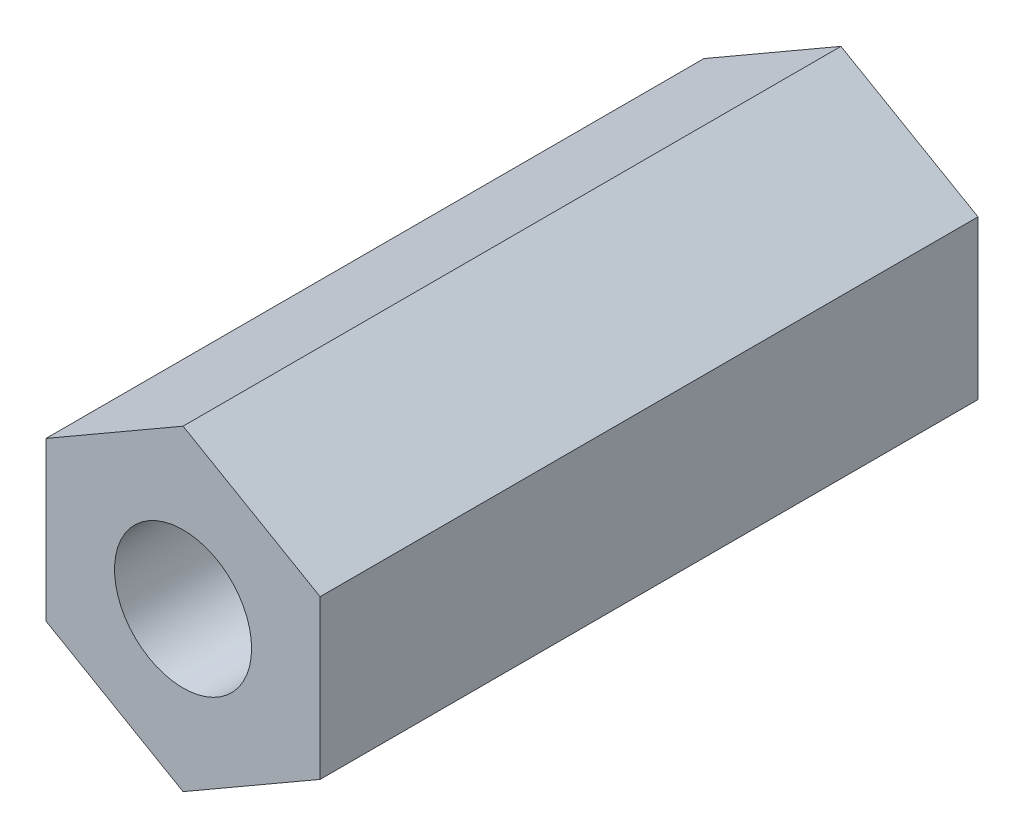
ISO-10303-21;
HEADER;
FILE_DESCRIPTION(('STEP AP214'),'2;1');
FILE_NAME('part.step','',(''),(''),'','','');
FILE_SCHEMA(('AUTOMOTIVE_DESIGN { 1 0 10303 214 1 1 1 1 }'));
ENDSEC;
DATA;
#1=APPLICATION_CONTEXT('core data for automotive mechanical design processes');
#2=APPLICATION_PROTOCOL_DEFINITION('international standard','automotive_design',2000,#1);
#3=PRODUCT_CONTEXT('',#1,'mechanical');
#4=PRODUCT('Part','Part','',(#3));
#5=PRODUCT_RELATED_PRODUCT_CATEGORY('part','',(#4));
#6=PRODUCT_DEFINITION_FORMATION('','',#4);
#7=PRODUCT_DEFINITION_CONTEXT('part definition',#1,'design');
#8=PRODUCT_DEFINITION('design','',#6,#7);
#9=PRODUCT_DEFINITION_SHAPE('','',#8);
#10=(LENGTH_UNIT() NAMED_UNIT(*) SI_UNIT(.MILLI.,.METRE.));
#11=(NAMED_UNIT(*) PLANE_ANGLE_UNIT() SI_UNIT($,.RADIAN.));
#12=(NAMED_UNIT(*) SI_UNIT($,.STERADIAN.) SOLID_ANGLE_UNIT());
#13=UNCERTAINTY_MEASURE_WITH_UNIT(LENGTH_MEASURE(1.E-05),#10,'distance_accuracy_value','');
#14=(GEOMETRIC_REPRESENTATION_CONTEXT(3) GLOBAL_UNCERTAINTY_ASSIGNED_CONTEXT((#13)) GLOBAL_UNIT_ASSIGNED_CONTEXT((#10,
#11,#12)) REPRESENTATION_CONTEXT('',''));
#15=CARTESIAN_POINT('',(0.,0.,0.));
#16=DIRECTION('',(0.,0.,1.));
#17=DIRECTION('',(1.,0.,0.));
#18=AXIS2_PLACEMENT_3D('',#15,#16,#17);
#19=CARTESIAN_POINT('',(2.5,-1.45337567297407,-0.01));
#20=DIRECTION('',(1.,0.,0.));
#21=DIRECTION('',(0.,1.,0.));
#22=AXIS2_PLACEMENT_3D('',#19,#20,#21);
#23=PLANE('',#22);
#24=DIRECTION('',(0.,1.,0.));
#25=VECTOR('',#24,1.);
#26=CARTESIAN_POINT('',(2.5,0.,12.));
#27=LINE('',#26,#25);
#28=CARTESIAN_POINT('',(2.5,-1.44337567297407,12.));
#29=VERTEX_POINT('',#28);
#30=CARTESIAN_POINT('',(2.5,1.44337567297406,12.));
#31=VERTEX_POINT('',#30);
#32=EDGE_CURVE('E89',#29,#31,#27,.T.);
#33=ORIENTED_EDGE('',*,*,#32,.F.);
#34=DIRECTION('',(0.,0.,1.));
#35=VECTOR('',#34,1.);
#36=CARTESIAN_POINT('',(2.5,-1.44337567297407,6.));
#37=LINE('',#36,#35);
#38=CARTESIAN_POINT('',(2.5,-1.44337567297407,0.));
#39=VERTEX_POINT('',#38);
#40=EDGE_CURVE('E96',#39,#29,#37,.T.);
#41=ORIENTED_EDGE('',*,*,#40,.F.);
#42=DIRECTION('',(0.,-1.,0.));
#43=VECTOR('',#42,1.);
#44=CARTESIAN_POINT('',(2.5,0.,0.));
#45=LINE('',#44,#43);
#46=CARTESIAN_POINT('',(2.5,1.44337567297406,0.));
#47=VERTEX_POINT('',#46);
#48=EDGE_CURVE('E106',#47,#39,#45,.T.);
#49=ORIENTED_EDGE('',*,*,#48,.F.);
#50=DIRECTION('',(0.,0.,-1.));
#51=VECTOR('',#50,1.);
#52=CARTESIAN_POINT('',(2.5,1.44337567297406,6.));
#53=LINE('',#52,#51);
#54=EDGE_CURVE('E68',#31,#47,#53,.T.);
#55=ORIENTED_EDGE('',*,*,#54,.F.);
#56=EDGE_LOOP('',(#33,#41,#49,#55));
#57=FACE_BOUND('',#56,.T.);
#58=ADVANCED_FACE('F17',(#57),#23,.T.);
#59=CARTESIAN_POINT('',(-0.00866025403784533,-2.89175134594813,-0.01));
#60=DIRECTION('',(0.499999999999998,-0.86602540378444,0.));
#61=DIRECTION('',(0.86602540378444,0.499999999999998,0.));
#62=AXIS2_PLACEMENT_3D('',#59,#60,#61);
#63=PLANE('',#62);
#64=DIRECTION('',(0.866025403784439,0.499999999999999,0.));
#65=VECTOR('',#64,1.);
#66=CARTESIAN_POINT('',(0.,-2.88675134594813,12.));
#67=LINE('',#66,#65);
#68=CARTESIAN_POINT('',(0.,-2.88675134594813,12.));
#69=VERTEX_POINT('',#68);
#70=EDGE_CURVE('E109',#69,#29,#67,.T.);
#71=ORIENTED_EDGE('',*,*,#70,.F.);
#72=DIRECTION('',(0.,0.,1.));
#73=VECTOR('',#72,1.);
#74=CARTESIAN_POINT('',(0.,-2.88675134594813,6.));
#75=LINE('',#74,#73);
#76=CARTESIAN_POINT('',(0.,-2.88675134594813,0.));
#77=VERTEX_POINT('',#76);
#78=EDGE_CURVE('E94',#77,#69,#75,.T.);
#79=ORIENTED_EDGE('',*,*,#78,.F.);
#80=DIRECTION('',(-0.866025403784439,-0.499999999999999,0.));
#81=VECTOR('',#80,1.);
#82=CARTESIAN_POINT('',(2.5,-1.44337567297407,0.));
#83=LINE('',#82,#81);
#84=EDGE_CURVE('E108',#39,#77,#83,.T.);
#85=ORIENTED_EDGE('',*,*,#84,.F.);
#86=ORIENTED_EDGE('',*,*,#40,.T.);
#87=EDGE_LOOP('',(#71,#79,#85,#86));
#88=FACE_BOUND('',#87,.T.);
#89=ADVANCED_FACE('F131',(#88),#63,.T.);
#90=CARTESIAN_POINT('',(-2.50866025403784,-1.43837567297407,-0.01));
#91=DIRECTION('',(-0.5,-0.866025403784439,0.));
#92=DIRECTION('',(0.866025403784439,-0.5,0.));
#93=AXIS2_PLACEMENT_3D('',#90,#91,#92);
#94=PLANE('',#93);
#95=DIRECTION('',(0.866025403784438,-0.500000000000001,0.));
#96=VECTOR('',#95,1.);
#97=CARTESIAN_POINT('',(-2.49999999999999,-1.44337567297407,12.));
#98=LINE('',#97,#96);
#99=CARTESIAN_POINT('',(-2.49999999999999,-1.44337567297407,12.));
#100=VERTEX_POINT('',#99);
#101=EDGE_CURVE('E120',#100,#69,#98,.T.);
#102=ORIENTED_EDGE('',*,*,#101,.F.);
#103=DIRECTION('',(0.,0.,1.));
#104=VECTOR('',#103,1.);
#105=CARTESIAN_POINT('',(-2.49999999999999,-1.44337567297407,6.));
#106=LINE('',#105,#104);
#107=CARTESIAN_POINT('',(-2.49999999999999,-1.44337567297407,0.));
#108=VERTEX_POINT('',#107);
#109=EDGE_CURVE('E100',#108,#100,#106,.T.);
#110=ORIENTED_EDGE('',*,*,#109,.F.);
#111=DIRECTION('',(-0.866025403784438,0.500000000000001,0.));
#112=VECTOR('',#111,1.);
#113=CARTESIAN_POINT('',(0.,-2.88675134594813,0.));
#114=LINE('',#113,#112);
#115=EDGE_CURVE('E105',#77,#108,#114,.T.);
#116=ORIENTED_EDGE('',*,*,#115,.F.);
#117=ORIENTED_EDGE('',*,*,#78,.T.);
#118=EDGE_LOOP('',(#102,#110,#116,#117));
#119=FACE_BOUND('',#118,.T.);
#120=ADVANCED_FACE('F128',(#119),#94,.T.);
#121=CARTESIAN_POINT('',(-2.49999999999999,1.45337567297406,-0.01));
#122=DIRECTION('',(-1.,0.,0.));
#123=DIRECTION('',(0.,-1.,0.));
#124=AXIS2_PLACEMENT_3D('',#121,#122,#123);
#125=PLANE('',#124);
#126=DIRECTION('',(0.,-1.,0.));
#127=VECTOR('',#126,1.);
#128=CARTESIAN_POINT('',(-2.49999999999999,0.,12.));
#129=LINE('',#128,#127);
#130=CARTESIAN_POINT('',(-2.49999999999999,1.44337567297406,12.));
#131=VERTEX_POINT('',#130);
#132=EDGE_CURVE('E85',#131,#100,#129,.T.);
#133=ORIENTED_EDGE('',*,*,#132,.F.);
#134=DIRECTION('',(0.,0.,1.));
#135=VECTOR('',#134,1.);
#136=CARTESIAN_POINT('',(-2.49999999999999,1.44337567297406,6.));
#137=LINE('',#136,#135);
#138=CARTESIAN_POINT('',(-2.49999999999999,1.44337567297406,0.));
#139=VERTEX_POINT('',#138);
#140=EDGE_CURVE('E77',#139,#131,#137,.T.);
#141=ORIENTED_EDGE('',*,*,#140,.F.);
#142=DIRECTION('',(0.,1.,0.));
#143=VECTOR('',#142,1.);
#144=CARTESIAN_POINT('',(-2.49999999999999,0.,0.));
#145=LINE('',#144,#143);
#146=EDGE_CURVE('E101',#108,#139,#145,.T.);
#147=ORIENTED_EDGE('',*,*,#146,.F.);
#148=ORIENTED_EDGE('',*,*,#109,.T.);
#149=EDGE_LOOP('',(#133,#141,#147,#148));
#150=FACE_BOUND('',#149,.T.);
#151=ADVANCED_FACE('F134',(#150),#125,.T.);
#152=CARTESIAN_POINT('',(0.00866025403783775,2.89175134594814,-0.01));
#153=DIRECTION('',(-0.500000000000006,0.866025403784435,0.));
#154=DIRECTION('',(-0.866025403784435,-0.500000000000006,0.));
#155=AXIS2_PLACEMENT_3D('',#152,#153,#154);
#156=PLANE('',#155);
#157=DIRECTION('',(-0.866025403784435,-0.500000000000006,0.));
#158=VECTOR('',#157,1.);
#159=CARTESIAN_POINT('',(0.,2.88675134594814,12.));
#160=LINE('',#159,#158);
#161=CARTESIAN_POINT('',(0.,2.88675134594814,12.));
#162=VERTEX_POINT('',#161);
#163=EDGE_CURVE('E80',#162,#131,#160,.T.);
#164=ORIENTED_EDGE('',*,*,#163,.F.);
#165=DIRECTION('',(0.,0.,1.));
#166=VECTOR('',#165,1.);
#167=CARTESIAN_POINT('',(0.,2.88675134594814,6.));
#168=LINE('',#167,#166);
#169=CARTESIAN_POINT('',(0.,2.88675134594814,0.));
#170=VERTEX_POINT('',#169);
#171=EDGE_CURVE('E36',#170,#162,#168,.T.);
#172=ORIENTED_EDGE('',*,*,#171,.F.);
#173=DIRECTION('',(0.866025403784435,0.500000000000007,0.));
#174=VECTOR('',#173,1.);
#175=CARTESIAN_POINT('',(-2.49999999999999,1.44337567297406,0.));
#176=LINE('',#175,#174);
#177=EDGE_CURVE('E104',#139,#170,#176,.T.);
#178=ORIENTED_EDGE('',*,*,#177,.F.);
#179=ORIENTED_EDGE('',*,*,#140,.T.);
#180=EDGE_LOOP('',(#164,#172,#178,#179));
#181=FACE_BOUND('',#180,.T.);
#182=ADVANCED_FACE('F81',(#181),#156,.T.);
#183=CARTESIAN_POINT('',(2.50866025403784,1.43837567297406,-0.01));
#184=DIRECTION('',(0.500000000000004,0.866025403784436,0.));
#185=DIRECTION('',(-0.866025403784436,0.500000000000004,0.));
#186=AXIS2_PLACEMENT_3D('',#183,#184,#185);
#187=PLANE('',#186);
#188=DIRECTION('',(-0.866025403784437,0.500000000000003,0.));
#189=VECTOR('',#188,1.);
#190=CARTESIAN_POINT('',(2.5,1.44337567297406,12.));
#191=LINE('',#190,#189);
#192=EDGE_CURVE('E21',#31,#162,#191,.T.);
#193=ORIENTED_EDGE('',*,*,#192,.F.);
#194=ORIENTED_EDGE('',*,*,#54,.T.);
#195=DIRECTION('',(0.866025403784437,-0.500000000000003,0.));
#196=VECTOR('',#195,1.);
#197=CARTESIAN_POINT('',(0.,2.88675134594814,0.));
#198=LINE('',#197,#196);
#199=EDGE_CURVE('E75',#170,#47,#198,.T.);
#200=ORIENTED_EDGE('',*,*,#199,.F.);
#201=ORIENTED_EDGE('',*,*,#171,.T.);
#202=EDGE_LOOP('',(#193,#194,#200,#201));
#203=FACE_BOUND('',#202,.T.);
#204=ADVANCED_FACE('F71',(#203),#187,.T.);
#205=CARTESIAN_POINT('',(-2.50999999999999,-2.89675134594813,12.));
#206=DIRECTION('',(0.,0.,1.));
#207=DIRECTION('',(1.,0.,0.));
#208=AXIS2_PLACEMENT_3D('',#205,#206,#207);
#209=PLANE('',#208);
#210=CARTESIAN_POINT('',(0.,0.,12.));
#211=DIRECTION('',(0.,0.,1.));
#212=DIRECTION('',(1.,0.,0.));
#213=AXIS2_PLACEMENT_3D('',#210,#211,#212);
#214=CIRCLE('',#213,1.25);
#215=CARTESIAN_POINT('',(1.25,0.,12.));
#216=VERTEX_POINT('',#215);
#217=EDGE_CURVE('E27',#216,#216,#214,.T.);
#218=ORIENTED_EDGE('',*,*,#217,.F.);
#219=EDGE_LOOP('',(#218));
#220=FACE_BOUND('',#219,.T.);
#221=ORIENTED_EDGE('',*,*,#101,.T.);
#222=ORIENTED_EDGE('',*,*,#70,.T.);
#223=ORIENTED_EDGE('',*,*,#32,.T.);
#224=ORIENTED_EDGE('',*,*,#192,.T.);
#225=ORIENTED_EDGE('',*,*,#163,.T.);
#226=ORIENTED_EDGE('',*,*,#132,.T.);
#227=EDGE_LOOP('',(#221,#222,#223,#224,#225,#226));
#228=FACE_BOUND('',#227,.T.);
#229=ADVANCED_FACE('F87',(#220,#228),#209,.T.);
#230=CARTESIAN_POINT('',(2.51,-2.89675134594813,0.));
#231=DIRECTION('',(0.,0.,-1.));
#232=DIRECTION('',(-1.,0.,0.));
#233=AXIS2_PLACEMENT_3D('',#230,#231,#232);
#234=PLANE('',#233);
#235=CARTESIAN_POINT('',(0.,0.,0.));
#236=DIRECTION('',(0.,0.,1.));
#237=DIRECTION('',(1.,0.,0.));
#238=AXIS2_PLACEMENT_3D('',#235,#236,#237);
#239=CIRCLE('',#238,1.25);
#240=CARTESIAN_POINT('',(1.25,0.,0.));
#241=VERTEX_POINT('',#240);
#242=EDGE_CURVE('E11',#241,#241,#239,.F.);
#243=ORIENTED_EDGE('',*,*,#242,.F.);
#244=EDGE_LOOP('',(#243));
#245=FACE_BOUND('',#244,.T.);
#246=ORIENTED_EDGE('',*,*,#177,.T.);
#247=ORIENTED_EDGE('',*,*,#199,.T.);
#248=ORIENTED_EDGE('',*,*,#48,.T.);
#249=ORIENTED_EDGE('',*,*,#84,.T.);
#250=ORIENTED_EDGE('',*,*,#115,.T.);
#251=ORIENTED_EDGE('',*,*,#146,.T.);
#252=EDGE_LOOP('',(#246,#247,#248,#249,#250,#251));
#253=FACE_BOUND('',#252,.T.);
#254=ADVANCED_FACE('F133',(#245,#253),#234,.T.);
#255=CARTESIAN_POINT('',(0.,0.,0.));
#256=DIRECTION('',(0.,0.,1.));
#257=DIRECTION('',(1.,0.,0.));
#258=AXIS2_PLACEMENT_3D('',#255,#256,#257);
#259=CYLINDRICAL_SURFACE('',#258,1.25);
#260=ORIENTED_EDGE('',*,*,#242,.T.);
#261=EDGE_LOOP('',(#260));
#262=FACE_BOUND('',#261,.T.);
#263=ORIENTED_EDGE('',*,*,#217,.T.);
#264=EDGE_LOOP('',(#263));
#265=FACE_BOUND('',#264,.T.);
#266=ADVANCED_FACE('F19',(#262,#265),#259,.F.);
#267=CLOSED_SHELL('',(#58,#89,#120,#151,#182,#204,#229,#254,#266));
#268=MANIFOLD_SOLID_BREP('B1',#267);
#269=ADVANCED_BREP_SHAPE_REPRESENTATION('',(#18,#268),#14);
#270=SHAPE_DEFINITION_REPRESENTATION(#9,#269);
ENDSEC;
END-ISO-10303-21;
